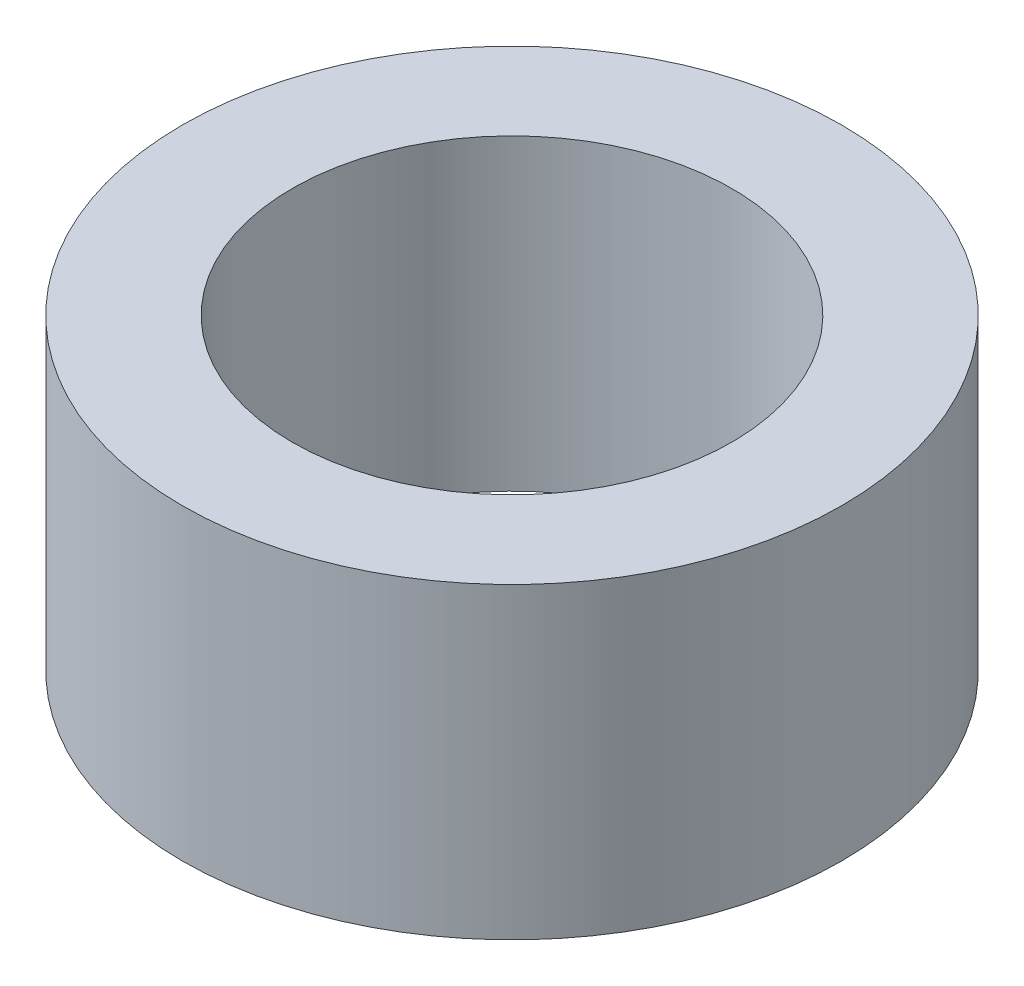
ISO-10303-21;
HEADER;
FILE_DESCRIPTION(('STEP AP214'),'2;1');
FILE_NAME('part.step','',(''),(''),'','','');
FILE_SCHEMA(('AUTOMOTIVE_DESIGN { 1 0 10303 214 1 1 1 1 }'));
ENDSEC;
DATA;
#1=APPLICATION_CONTEXT('core data for automotive mechanical design processes');
#2=APPLICATION_PROTOCOL_DEFINITION('international standard','automotive_design',2000,#1);
#3=PRODUCT_CONTEXT('',#1,'mechanical');
#4=PRODUCT('Part','Part','',(#3));
#5=PRODUCT_RELATED_PRODUCT_CATEGORY('part','',(#4));
#6=PRODUCT_DEFINITION_FORMATION('','',#4);
#7=PRODUCT_DEFINITION_CONTEXT('part definition',#1,'design');
#8=PRODUCT_DEFINITION('design','',#6,#7);
#9=PRODUCT_DEFINITION_SHAPE('','',#8);
#10=(LENGTH_UNIT() NAMED_UNIT(*) SI_UNIT(.MILLI.,.METRE.));
#11=(NAMED_UNIT(*) PLANE_ANGLE_UNIT() SI_UNIT($,.RADIAN.));
#12=(NAMED_UNIT(*) SI_UNIT($,.STERADIAN.) SOLID_ANGLE_UNIT());
#13=UNCERTAINTY_MEASURE_WITH_UNIT(LENGTH_MEASURE(1.E-05),#10,'distance_accuracy_value','');
#14=(GEOMETRIC_REPRESENTATION_CONTEXT(3) GLOBAL_UNCERTAINTY_ASSIGNED_CONTEXT((#13)) GLOBAL_UNIT_ASSIGNED_CONTEXT((#10,
#11,#12)) REPRESENTATION_CONTEXT('',''));
#15=CARTESIAN_POINT('',(0.,0.,0.));
#16=DIRECTION('',(0.,0.,1.));
#17=DIRECTION('',(1.,0.,0.));
#18=AXIS2_PLACEMENT_3D('',#15,#16,#17);
#19=CARTESIAN_POINT('',(0.,14.,0.));
#20=DIRECTION('',(0.,1.,0.));
#21=DIRECTION('',(0.,0.,1.));
#22=AXIS2_PLACEMENT_3D('',#19,#20,#21);
#23=PLANE('',#22);
#24=CARTESIAN_POINT('',(0.,14.,0.));
#25=DIRECTION('',(0.,1.,0.));
#26=DIRECTION('',(0.,0.,1.));
#27=AXIS2_PLACEMENT_3D('',#24,#25,#26);
#28=CIRCLE('',#27,30.);
#29=CARTESIAN_POINT('',(0.,14.,30.));
#30=VERTEX_POINT('',#29);
#31=EDGE_CURVE('E10',#30,#30,#28,.T.);
#32=ORIENTED_EDGE('',*,*,#31,.T.);
#33=EDGE_LOOP('',(#32));
#34=FACE_BOUND('',#33,.T.);
#35=CARTESIAN_POINT('',(0.,14.,0.));
#36=DIRECTION('',(0.,1.,0.));
#37=DIRECTION('',(0.,0.,1.));
#38=AXIS2_PLACEMENT_3D('',#35,#36,#37);
#39=CIRCLE('',#38,20.);
#40=CARTESIAN_POINT('',(0.,14.,20.));
#41=VERTEX_POINT('',#40);
#42=EDGE_CURVE('E52',#41,#41,#39,.T.);
#43=ORIENTED_EDGE('',*,*,#42,.F.);
#44=EDGE_LOOP('',(#43));
#45=FACE_BOUND('',#44,.T.);
#46=ADVANCED_FACE('F41',(#34,#45),#23,.T.);
#47=CARTESIAN_POINT('',(0.,-14.,0.));
#48=DIRECTION('',(0.,1.,0.));
#49=DIRECTION('',(0.,0.,1.));
#50=AXIS2_PLACEMENT_3D('',#47,#48,#49);
#51=PLANE('',#50);
#52=CARTESIAN_POINT('',(0.,-14.,0.));
#53=DIRECTION('',(0.,1.,0.));
#54=DIRECTION('',(0.,0.,1.));
#55=AXIS2_PLACEMENT_3D('',#52,#53,#54);
#56=CIRCLE('',#55,30.);
#57=CARTESIAN_POINT('',(0.,-14.,30.));
#58=VERTEX_POINT('',#57);
#59=EDGE_CURVE('E45',#58,#58,#56,.T.);
#60=ORIENTED_EDGE('',*,*,#59,.F.);
#61=EDGE_LOOP('',(#60));
#62=FACE_BOUND('',#61,.T.);
#63=CARTESIAN_POINT('',(0.,-14.,0.));
#64=DIRECTION('',(0.,1.,0.));
#65=DIRECTION('',(0.,0.,1.));
#66=AXIS2_PLACEMENT_3D('',#63,#64,#65);
#67=CIRCLE('',#66,20.);
#68=CARTESIAN_POINT('',(0.,-14.,20.));
#69=VERTEX_POINT('',#68);
#70=EDGE_CURVE('E54',#69,#69,#67,.T.);
#71=ORIENTED_EDGE('',*,*,#70,.T.);
#72=EDGE_LOOP('',(#71));
#73=FACE_BOUND('',#72,.T.);
#74=ADVANCED_FACE('F64',(#62,#73),#51,.F.);
#75=CARTESIAN_POINT('',(0.,14.,0.));
#76=DIRECTION('',(0.,-1.,0.));
#77=DIRECTION('',(0.,0.,-1.));
#78=AXIS2_PLACEMENT_3D('',#75,#76,#77);
#79=CYLINDRICAL_SURFACE('',#78,30.);
#80=ORIENTED_EDGE('',*,*,#31,.F.);
#81=EDGE_LOOP('',(#80));
#82=FACE_BOUND('',#81,.T.);
#83=ORIENTED_EDGE('',*,*,#59,.T.);
#84=EDGE_LOOP('',(#83));
#85=FACE_BOUND('',#84,.T.);
#86=ADVANCED_FACE('F43',(#82,#85),#79,.T.);
#87=CARTESIAN_POINT('',(0.,14.,0.));
#88=DIRECTION('',(0.,-1.,0.));
#89=DIRECTION('',(0.,0.,-1.));
#90=AXIS2_PLACEMENT_3D('',#87,#88,#89);
#91=CYLINDRICAL_SURFACE('',#90,20.);
#92=ORIENTED_EDGE('',*,*,#42,.T.);
#93=EDGE_LOOP('',(#92));
#94=FACE_BOUND('',#93,.T.);
#95=ORIENTED_EDGE('',*,*,#70,.F.);
#96=EDGE_LOOP('',(#95));
#97=FACE_BOUND('',#96,.T.);
#98=ADVANCED_FACE('F60',(#94,#97),#91,.F.);
#99=CLOSED_SHELL('',(#46,#74,#86,#98));
#100=MANIFOLD_SOLID_BREP('B2',#99);
#101=ADVANCED_BREP_SHAPE_REPRESENTATION('',(#18,#100),#14);
#102=SHAPE_DEFINITION_REPRESENTATION(#9,#101);
ENDSEC;
END-ISO-10303-21;
